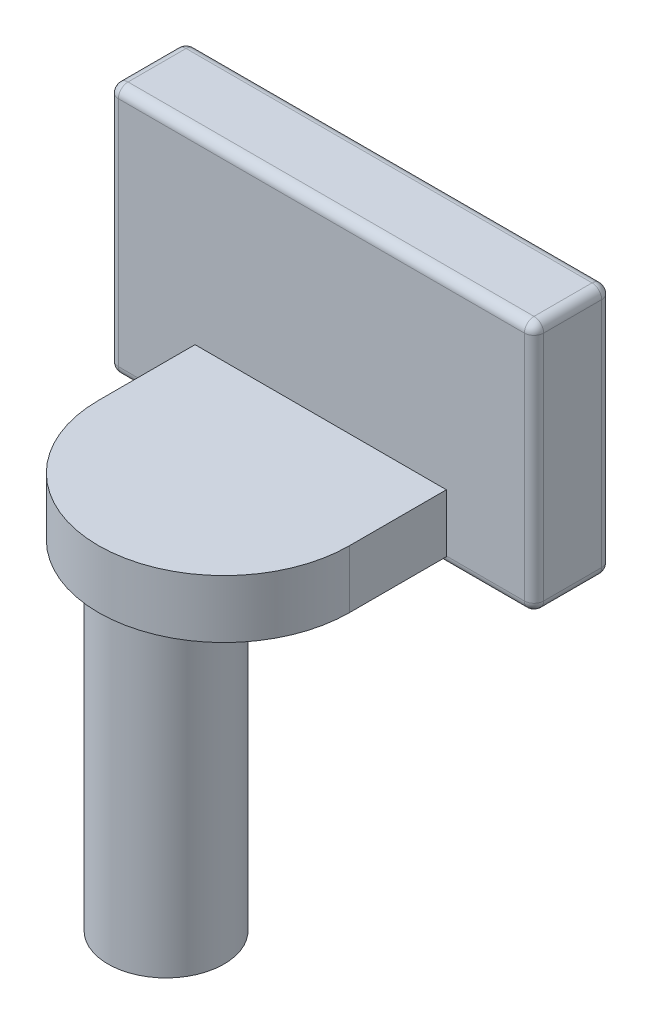
ISO-10303-21;
HEADER;
FILE_DESCRIPTION(('STEP AP214'),'2;1');
FILE_NAME('part.step','',(''),(''),'','','');
FILE_SCHEMA(('AUTOMOTIVE_DESIGN { 1 0 10303 214 1 1 1 1 }'));
ENDSEC;
DATA;
#1=APPLICATION_CONTEXT('core data for automotive mechanical design processes');
#2=APPLICATION_PROTOCOL_DEFINITION('international standard','automotive_design',2000,#1);
#3=PRODUCT_CONTEXT('',#1,'mechanical');
#4=PRODUCT('Part','Part','',(#3));
#5=PRODUCT_RELATED_PRODUCT_CATEGORY('part','',(#4));
#6=PRODUCT_DEFINITION_FORMATION('','',#4);
#7=PRODUCT_DEFINITION_CONTEXT('part definition',#1,'design');
#8=PRODUCT_DEFINITION('design','',#6,#7);
#9=PRODUCT_DEFINITION_SHAPE('','',#8);
#10=(LENGTH_UNIT() NAMED_UNIT(*) SI_UNIT(.MILLI.,.METRE.));
#11=(NAMED_UNIT(*) PLANE_ANGLE_UNIT() SI_UNIT($,.RADIAN.));
#12=(NAMED_UNIT(*) SI_UNIT($,.STERADIAN.) SOLID_ANGLE_UNIT());
#13=UNCERTAINTY_MEASURE_WITH_UNIT(LENGTH_MEASURE(1.E-05),#10,'distance_accuracy_value','');
#14=(GEOMETRIC_REPRESENTATION_CONTEXT(3) GLOBAL_UNCERTAINTY_ASSIGNED_CONTEXT((#13)) GLOBAL_UNIT_ASSIGNED_CONTEXT((#10,
#11,#12)) REPRESENTATION_CONTEXT('',''));
#15=CARTESIAN_POINT('',(0.,0.,0.));
#16=DIRECTION('',(0.,0.,1.));
#17=DIRECTION('',(1.,0.,0.));
#18=AXIS2_PLACEMENT_3D('',#15,#16,#17);
#19=CARTESIAN_POINT('',(0.,-30.,90.3432418316288));
#20=DIRECTION('',(0.,-1.,0.));
#21=DIRECTION('',(0.,0.,-1.));
#22=AXIS2_PLACEMENT_3D('',#19,#20,#21);
#23=CYLINDRICAL_SURFACE('',#22,65.);
#24=CARTESIAN_POINT('',(0.,-60.,90.3432418316288));
#25=DIRECTION('',(0.,1.,0.));
#26=DIRECTION('',(0.,0.,1.));
#27=AXIS2_PLACEMENT_3D('',#24,#25,#26);
#28=CIRCLE('',#27,65.);
#29=CARTESIAN_POINT('',(-65.,-60.,90.3432418316288));
#30=VERTEX_POINT('',#29);
#31=CARTESIAN_POINT('',(65.,-60.,90.3432418316288));
#32=VERTEX_POINT('',#31);
#33=EDGE_CURVE('E120',#30,#32,#28,.T.);
#34=ORIENTED_EDGE('',*,*,#33,.T.);
#35=DIRECTION('',(0.,-1.,0.));
#36=VECTOR('',#35,1.);
#37=CARTESIAN_POINT('',(65.,-30.,90.3432418316288));
#38=LINE('',#37,#36);
#39=CARTESIAN_POINT('',(65.,-30.,90.3432418316288));
#40=VERTEX_POINT('',#39);
#41=EDGE_CURVE('E52',#40,#32,#38,.T.);
#42=ORIENTED_EDGE('',*,*,#41,.F.);
#43=CARTESIAN_POINT('',(0.,-30.,90.3432418316288));
#44=DIRECTION('',(0.,1.,0.));
#45=DIRECTION('',(0.,0.,1.));
#46=AXIS2_PLACEMENT_3D('',#43,#44,#45);
#47=CIRCLE('',#46,65.);
#48=CARTESIAN_POINT('',(-65.,-30.,90.3432418316288));
#49=VERTEX_POINT('',#48);
#50=EDGE_CURVE('E103',#49,#40,#47,.T.);
#51=ORIENTED_EDGE('',*,*,#50,.F.);
#52=DIRECTION('',(0.,-1.,0.));
#53=VECTOR('',#52,1.);
#54=CARTESIAN_POINT('',(-65.,-30.,90.3432418316288));
#55=LINE('',#54,#53);
#56=EDGE_CURVE('E116',#49,#30,#55,.T.);
#57=ORIENTED_EDGE('',*,*,#56,.T.);
#58=EDGE_LOOP('',(#34,#42,#51,#57));
#59=FACE_BOUND('',#58,.T.);
#60=ADVANCED_FACE('F49',(#59),#23,.T.);
#61=CARTESIAN_POINT('',(65.,-30.,40.3432418316288));
#62=DIRECTION('',(-1.,0.,0.));
#63=DIRECTION('',(0.,0.,1.));
#64=AXIS2_PLACEMENT_3D('',#61,#62,#63);
#65=PLANE('',#64);
#66=DIRECTION('',(0.,0.,-1.));
#67=VECTOR('',#66,1.);
#68=CARTESIAN_POINT('',(65.,-60.,40.3432418316288));
#69=LINE('',#68,#67);
#70=CARTESIAN_POINT('',(65.,-60.,40.3432418316288));
#71=VERTEX_POINT('',#70);
#72=EDGE_CURVE('E109',#32,#71,#69,.T.);
#73=ORIENTED_EDGE('',*,*,#72,.T.);
#74=DIRECTION('',(0.,-1.,0.));
#75=VECTOR('',#74,1.);
#76=CARTESIAN_POINT('',(65.,-30.,40.3432418316288));
#77=LINE('',#76,#75);
#78=CARTESIAN_POINT('',(65.,-30.,40.3432418316288));
#79=VERTEX_POINT('',#78);
#80=EDGE_CURVE('E107',#79,#71,#77,.T.);
#81=ORIENTED_EDGE('',*,*,#80,.F.);
#82=DIRECTION('',(0.,0.,-1.));
#83=VECTOR('',#82,1.);
#84=CARTESIAN_POINT('',(65.,-30.,40.3432418316288));
#85=LINE('',#84,#83);
#86=EDGE_CURVE('E98',#40,#79,#85,.T.);
#87=ORIENTED_EDGE('',*,*,#86,.F.);
#88=ORIENTED_EDGE('',*,*,#41,.T.);
#89=EDGE_LOOP('',(#73,#81,#87,#88));
#90=FACE_BOUND('',#89,.T.);
#91=ADVANCED_FACE('F108',(#90),#65,.F.);
#92=CARTESIAN_POINT('',(-65.,-30.,40.3432418316288));
#93=DIRECTION('',(0.,0.,1.));
#94=DIRECTION('',(1.,0.,0.));
#95=AXIS2_PLACEMENT_3D('',#92,#93,#94);
#96=PLANE('',#95);
#97=DIRECTION('',(-1.,0.,0.));
#98=VECTOR('',#97,1.);
#99=CARTESIAN_POINT('',(-65.,-60.,40.3432418316288));
#100=LINE('',#99,#98);
#101=CARTESIAN_POINT('',(-65.,-60.,40.3432418316288));
#102=VERTEX_POINT('',#101);
#103=EDGE_CURVE('E84',#71,#102,#100,.T.);
#104=ORIENTED_EDGE('',*,*,#103,.T.);
#105=DIRECTION('',(0.,-1.,0.));
#106=VECTOR('',#105,1.);
#107=CARTESIAN_POINT('',(-65.,-30.,40.3432418316288));
#108=LINE('',#107,#106);
#109=CARTESIAN_POINT('',(-65.,-30.,40.3432418316288));
#110=VERTEX_POINT('',#109);
#111=EDGE_CURVE('E111',#110,#102,#108,.T.);
#112=ORIENTED_EDGE('',*,*,#111,.F.);
#113=DIRECTION('',(-1.,0.,0.));
#114=VECTOR('',#113,1.);
#115=CARTESIAN_POINT('',(-65.,-30.,40.3432418316288));
#116=LINE('',#115,#114);
#117=EDGE_CURVE('E101',#79,#110,#116,.T.);
#118=ORIENTED_EDGE('',*,*,#117,.F.);
#119=ORIENTED_EDGE('',*,*,#80,.T.);
#120=EDGE_LOOP('',(#104,#112,#118,#119));
#121=FACE_BOUND('',#120,.T.);
#122=ADVANCED_FACE('F112',(#121),#96,.F.);
#123=CARTESIAN_POINT('',(-65.,-30.,40.3432418316288));
#124=DIRECTION('',(1.,0.,0.));
#125=DIRECTION('',(0.,0.,-1.));
#126=AXIS2_PLACEMENT_3D('',#123,#124,#125);
#127=PLANE('',#126);
#128=DIRECTION('',(0.,0.,1.));
#129=VECTOR('',#128,1.);
#130=CARTESIAN_POINT('',(-65.,-60.,40.3432418316288));
#131=LINE('',#130,#129);
#132=EDGE_CURVE('E90',#102,#30,#131,.T.);
#133=ORIENTED_EDGE('',*,*,#132,.T.);
#134=ORIENTED_EDGE('',*,*,#56,.F.);
#135=DIRECTION('',(0.,0.,1.));
#136=VECTOR('',#135,1.);
#137=CARTESIAN_POINT('',(-65.,-30.,40.3432418316288));
#138=LINE('',#137,#136);
#139=EDGE_CURVE('E67',#110,#49,#138,.T.);
#140=ORIENTED_EDGE('',*,*,#139,.F.);
#141=ORIENTED_EDGE('',*,*,#111,.T.);
#142=EDGE_LOOP('',(#133,#134,#140,#141));
#143=FACE_BOUND('',#142,.T.);
#144=ADVANCED_FACE('F134',(#143),#127,.F.);
#145=CARTESIAN_POINT('',(0.,-30.,90.3432418316288));
#146=DIRECTION('',(0.,1.,0.));
#147=DIRECTION('',(0.,0.,1.));
#148=AXIS2_PLACEMENT_3D('',#145,#146,#147);
#149=PLANE('',#148);
#150=ORIENTED_EDGE('',*,*,#50,.T.);
#151=ORIENTED_EDGE('',*,*,#86,.T.);
#152=ORIENTED_EDGE('',*,*,#117,.T.);
#153=ORIENTED_EDGE('',*,*,#139,.T.);
#154=EDGE_LOOP('',(#150,#151,#152,#153));
#155=FACE_BOUND('',#154,.T.);
#156=ADVANCED_FACE('F99',(#155),#149,.T.);
#157=CARTESIAN_POINT('',(0.,-60.,90.3432418316288));
#158=DIRECTION('',(0.,1.,0.));
#159=DIRECTION('',(0.,0.,1.));
#160=AXIS2_PLACEMENT_3D('',#157,#158,#159);
#161=PLANE('',#160);
#162=CARTESIAN_POINT('',(0.,-60.,120.343241831629));
#163=DIRECTION('',(0.,-1.,0.));
#164=DIRECTION('',(0.,0.,-1.));
#165=AXIS2_PLACEMENT_3D('',#162,#163,#164);
#166=CIRCLE('',#165,30.);
#167=CARTESIAN_POINT('',(0.,-60.,90.3432418316288));
#168=VERTEX_POINT('',#167);
#169=EDGE_CURVE('E12',#168,#168,#166,.T.);
#170=ORIENTED_EDGE('',*,*,#169,.F.);
#171=EDGE_LOOP('',(#170));
#172=FACE_BOUND('',#171,.T.);
#173=ORIENTED_EDGE('',*,*,#33,.F.);
#174=ORIENTED_EDGE('',*,*,#132,.F.);
#175=ORIENTED_EDGE('',*,*,#103,.F.);
#176=ORIENTED_EDGE('',*,*,#72,.F.);
#177=EDGE_LOOP('',(#173,#174,#175,#176));
#178=FACE_BOUND('',#177,.T.);
#179=ADVANCED_FACE('F137',(#172,#178),#161,.F.);
#180=CARTESIAN_POINT('',(0.,-220.,120.343241831629));
#181=DIRECTION('',(0.,1.,0.));
#182=DIRECTION('',(0.,0.,1.));
#183=AXIS2_PLACEMENT_3D('',#180,#181,#182);
#184=CYLINDRICAL_SURFACE('',#183,30.);
#185=CARTESIAN_POINT('',(0.,-220.,120.343241831629));
#186=DIRECTION('',(0.,-1.,0.));
#187=DIRECTION('',(0.,0.,-1.));
#188=AXIS2_PLACEMENT_3D('',#185,#186,#187);
#189=CIRCLE('',#188,30.);
#190=CARTESIAN_POINT('',(0.,-220.,90.3432418316288));
#191=VERTEX_POINT('',#190);
#192=EDGE_CURVE('E124',#191,#191,#189,.T.);
#193=ORIENTED_EDGE('',*,*,#192,.F.);
#194=EDGE_LOOP('',(#193));
#195=FACE_BOUND('',#194,.T.);
#196=ORIENTED_EDGE('',*,*,#169,.T.);
#197=EDGE_LOOP('',(#196));
#198=FACE_BOUND('',#197,.T.);
#199=ADVANCED_FACE('F147',(#195,#198),#184,.T.);
#200=CARTESIAN_POINT('',(0.,-220.,120.343241831629));
#201=DIRECTION('',(0.,-1.,0.));
#202=DIRECTION('',(0.,0.,-1.));
#203=AXIS2_PLACEMENT_3D('',#200,#201,#202);
#204=PLANE('',#203);
#205=ORIENTED_EDGE('',*,*,#192,.T.);
#206=EDGE_LOOP('',(#205));
#207=FACE_BOUND('',#206,.T.);
#208=ADVANCED_FACE('F145',(#207),#204,.T.);
#209=CLOSED_SHELL('',(#60,#91,#122,#144,#156,#179,#199,#208));
#210=MANIFOLD_SOLID_BREP('B2',#209);
#211=CARTESIAN_POINT('',(-110.,65.,40.));
#212=DIRECTION('',(1.,0.,0.));
#213=DIRECTION('',(0.,0.,-1.));
#214=AXIS2_PLACEMENT_3D('',#211,#212,#213);
#215=PLANE('',#214);
#216=DIRECTION('',(0.,-1.,0.));
#217=VECTOR('',#216,1.);
#218=CARTESIAN_POINT('',(-110.,65.,5.));
#219=LINE('',#218,#217);
#220=CARTESIAN_POINT('',(-110.,60.,5.));
#221=VERTEX_POINT('',#220);
#222=CARTESIAN_POINT('',(-110.,-60.,5.));
#223=VERTEX_POINT('',#222);
#224=EDGE_CURVE('E390',#221,#223,#219,.T.);
#225=ORIENTED_EDGE('',*,*,#224,.T.);
#226=DIRECTION('',(0.,0.,-1.));
#227=VECTOR('',#226,1.);
#228=CARTESIAN_POINT('',(-110.,-60.,40.));
#229=LINE('',#228,#227);
#230=CARTESIAN_POINT('',(-110.,-60.,35.));
#231=VERTEX_POINT('',#230);
#232=EDGE_CURVE('E392',#223,#231,#229,.F.);
#233=ORIENTED_EDGE('',*,*,#232,.T.);
#234=DIRECTION('',(0.,-1.,0.));
#235=VECTOR('',#234,1.);
#236=CARTESIAN_POINT('',(-110.,65.,35.));
#237=LINE('',#236,#235);
#238=CARTESIAN_POINT('',(-110.,60.,35.));
#239=VERTEX_POINT('',#238);
#240=EDGE_CURVE('E386',#231,#239,#237,.F.);
#241=ORIENTED_EDGE('',*,*,#240,.T.);
#242=DIRECTION('',(0.,0.,-1.));
#243=VECTOR('',#242,1.);
#244=CARTESIAN_POINT('',(-110.,60.,0.));
#245=LINE('',#244,#243);
#246=EDGE_CURVE('E388',#239,#221,#245,.T.);
#247=ORIENTED_EDGE('',*,*,#246,.T.);
#248=EDGE_LOOP('',(#225,#233,#241,#247));
#249=FACE_BOUND('',#248,.T.);
#250=ADVANCED_FACE('F217',(#249),#215,.F.);
#251=CARTESIAN_POINT('',(-110.,-65.,40.));
#252=DIRECTION('',(0.,1.,0.));
#253=DIRECTION('',(0.,0.,1.));
#254=AXIS2_PLACEMENT_3D('',#251,#252,#253);
#255=PLANE('',#254);
#256=DIRECTION('',(1.,0.,0.));
#257=VECTOR('',#256,1.);
#258=CARTESIAN_POINT('',(-110.,-65.,35.));
#259=LINE('',#258,#257);
#260=CARTESIAN_POINT('',(105.,-65.,35.));
#261=VERTEX_POINT('',#260);
#262=CARTESIAN_POINT('',(-105.,-65.,35.));
#263=VERTEX_POINT('',#262);
#264=EDGE_CURVE('E378',#261,#263,#259,.F.);
#265=ORIENTED_EDGE('',*,*,#264,.T.);
#266=DIRECTION('',(0.,0.,-1.));
#267=VECTOR('',#266,1.);
#268=CARTESIAN_POINT('',(-105.,-65.,40.));
#269=LINE('',#268,#267);
#270=CARTESIAN_POINT('',(-105.,-65.,5.));
#271=VERTEX_POINT('',#270);
#272=EDGE_CURVE('E383',#263,#271,#269,.T.);
#273=ORIENTED_EDGE('',*,*,#272,.T.);
#274=DIRECTION('',(1.,0.,0.));
#275=VECTOR('',#274,1.);
#276=CARTESIAN_POINT('',(-110.,-65.,5.));
#277=LINE('',#276,#275);
#278=CARTESIAN_POINT('',(105.,-65.,5.));
#279=VERTEX_POINT('',#278);
#280=EDGE_CURVE('E381',#271,#279,#277,.T.);
#281=ORIENTED_EDGE('',*,*,#280,.T.);
#282=DIRECTION('',(0.,0.,-1.));
#283=VECTOR('',#282,1.);
#284=CARTESIAN_POINT('',(105.,-65.,40.));
#285=LINE('',#284,#283);
#286=EDGE_CURVE('E376',#279,#261,#285,.F.);
#287=ORIENTED_EDGE('',*,*,#286,.T.);
#288=EDGE_LOOP('',(#265,#273,#281,#287));
#289=FACE_BOUND('',#288,.T.);
#290=ADVANCED_FACE('F538',(#289),#255,.F.);
#291=CARTESIAN_POINT('',(110.,65.,40.));
#292=DIRECTION('',(1.,0.,0.));
#293=DIRECTION('',(0.,0.,-1.));
#294=AXIS2_PLACEMENT_3D('',#291,#292,#293);
#295=PLANE('',#294);
#296=DIRECTION('',(0.,-1.,0.));
#297=VECTOR('',#296,1.);
#298=CARTESIAN_POINT('',(110.,65.,35.));
#299=LINE('',#298,#297);
#300=CARTESIAN_POINT('',(110.,60.,35.));
#301=VERTEX_POINT('',#300);
#302=CARTESIAN_POINT('',(110.,-60.,35.));
#303=VERTEX_POINT('',#302);
#304=EDGE_CURVE('E426',#301,#303,#299,.T.);
#305=ORIENTED_EDGE('',*,*,#304,.T.);
#306=DIRECTION('',(0.,0.,-1.));
#307=VECTOR('',#306,1.);
#308=CARTESIAN_POINT('',(110.,-60.,0.));
#309=LINE('',#308,#307);
#310=CARTESIAN_POINT('',(110.,-60.,5.));
#311=VERTEX_POINT('',#310);
#312=EDGE_CURVE('E428',#303,#311,#309,.T.);
#313=ORIENTED_EDGE('',*,*,#312,.T.);
#314=DIRECTION('',(0.,-1.,0.));
#315=VECTOR('',#314,1.);
#316=CARTESIAN_POINT('',(110.,65.,5.));
#317=LINE('',#316,#315);
#318=CARTESIAN_POINT('',(110.,60.,5.));
#319=VERTEX_POINT('',#318);
#320=EDGE_CURVE('E422',#311,#319,#317,.F.);
#321=ORIENTED_EDGE('',*,*,#320,.T.);
#322=DIRECTION('',(0.,0.,-1.));
#323=VECTOR('',#322,1.);
#324=CARTESIAN_POINT('',(110.,60.,40.));
#325=LINE('',#324,#323);
#326=EDGE_CURVE('E424',#319,#301,#325,.F.);
#327=ORIENTED_EDGE('',*,*,#326,.T.);
#328=EDGE_LOOP('',(#305,#313,#321,#327));
#329=FACE_BOUND('',#328,.T.);
#330=ADVANCED_FACE('F544',(#329),#295,.T.);
#331=CARTESIAN_POINT('',(-110.,65.,40.));
#332=DIRECTION('',(0.,1.,0.));
#333=DIRECTION('',(0.,0.,1.));
#334=AXIS2_PLACEMENT_3D('',#331,#332,#333);
#335=PLANE('',#334);
#336=DIRECTION('',(1.,0.,0.));
#337=VECTOR('',#336,1.);
#338=CARTESIAN_POINT('',(-110.,65.,5.));
#339=LINE('',#338,#337);
#340=CARTESIAN_POINT('',(105.,65.,5.));
#341=VERTEX_POINT('',#340);
#342=CARTESIAN_POINT('',(-105.,65.,5.));
#343=VERTEX_POINT('',#342);
#344=EDGE_CURVE('E408',#341,#343,#339,.F.);
#345=ORIENTED_EDGE('',*,*,#344,.T.);
#346=DIRECTION('',(0.,0.,-1.));
#347=VECTOR('',#346,1.);
#348=CARTESIAN_POINT('',(-105.,65.,40.));
#349=LINE('',#348,#347);
#350=CARTESIAN_POINT('',(-105.,65.,35.));
#351=VERTEX_POINT('',#350);
#352=EDGE_CURVE('E410',#343,#351,#349,.F.);
#353=ORIENTED_EDGE('',*,*,#352,.T.);
#354=DIRECTION('',(1.,0.,0.));
#355=VECTOR('',#354,1.);
#356=CARTESIAN_POINT('',(-110.,65.,35.));
#357=LINE('',#356,#355);
#358=CARTESIAN_POINT('',(105.,65.,35.));
#359=VERTEX_POINT('',#358);
#360=EDGE_CURVE('E406',#351,#359,#357,.T.);
#361=ORIENTED_EDGE('',*,*,#360,.T.);
#362=DIRECTION('',(0.,0.,-1.));
#363=VECTOR('',#362,1.);
#364=CARTESIAN_POINT('',(105.,65.,40.));
#365=LINE('',#364,#363);
#366=EDGE_CURVE('E404',#359,#341,#365,.T.);
#367=ORIENTED_EDGE('',*,*,#366,.T.);
#368=EDGE_LOOP('',(#345,#353,#361,#367));
#369=FACE_BOUND('',#368,.T.);
#370=ADVANCED_FACE('F830',(#369),#335,.T.);
#371=CARTESIAN_POINT('',(0.,0.,40.));
#372=DIRECTION('',(0.,0.,1.));
#373=DIRECTION('',(1.,0.,0.));
#374=AXIS2_PLACEMENT_3D('',#371,#372,#373);
#375=PLANE('',#374);
#376=DIRECTION('',(1.,0.,0.));
#377=VECTOR('',#376,1.);
#378=CARTESIAN_POINT('',(0.,60.,40.));
#379=LINE('',#378,#377);
#380=CARTESIAN_POINT('',(105.,60.,40.));
#381=VERTEX_POINT('',#380);
#382=CARTESIAN_POINT('',(-105.,60.,40.));
#383=VERTEX_POINT('',#382);
#384=EDGE_CURVE('E417',#381,#383,#379,.F.);
#385=ORIENTED_EDGE('',*,*,#384,.T.);
#386=DIRECTION('',(0.,-1.,0.));
#387=VECTOR('',#386,1.);
#388=CARTESIAN_POINT('',(-105.,-65.,40.));
#389=LINE('',#388,#387);
#390=CARTESIAN_POINT('',(-105.,-60.,40.));
#391=VERTEX_POINT('',#390);
#392=EDGE_CURVE('E420',#383,#391,#389,.T.);
#393=ORIENTED_EDGE('',*,*,#392,.T.);
#394=DIRECTION('',(1.,0.,0.));
#395=VECTOR('',#394,1.);
#396=CARTESIAN_POINT('',(110.,-60.,40.));
#397=LINE('',#396,#395);
#398=CARTESIAN_POINT('',(105.,-60.,40.));
#399=VERTEX_POINT('',#398);
#400=EDGE_CURVE('E415',#391,#399,#397,.T.);
#401=ORIENTED_EDGE('',*,*,#400,.T.);
#402=DIRECTION('',(0.,-1.,0.));
#403=VECTOR('',#402,1.);
#404=CARTESIAN_POINT('',(105.,0.,40.));
#405=LINE('',#404,#403);
#406=EDGE_CURVE('E413',#399,#381,#405,.F.);
#407=ORIENTED_EDGE('',*,*,#406,.T.);
#408=EDGE_LOOP('',(#385,#393,#401,#407));
#409=FACE_BOUND('',#408,.T.);
#410=ADVANCED_FACE('F699',(#409),#375,.T.);
#411=CARTESIAN_POINT('',(0.,0.,0.));
#412=DIRECTION('',(0.,0.,1.));
#413=DIRECTION('',(1.,0.,0.));
#414=AXIS2_PLACEMENT_3D('',#411,#412,#413);
#415=PLANE('',#414);
#416=DIRECTION('',(1.,0.,0.));
#417=VECTOR('',#416,1.);
#418=CARTESIAN_POINT('',(0.,55.5,0.));
#419=LINE('',#418,#417);
#420=CARTESIAN_POINT('',(100.5,55.5,0.));
#421=VERTEX_POINT('',#420);
#422=CARTESIAN_POINT('',(-100.5,55.5,0.));
#423=VERTEX_POINT('',#422);
#424=EDGE_CURVE('E497',#421,#423,#419,.F.);
#425=ORIENTED_EDGE('',*,*,#424,.T.);
#426=DIRECTION('',(0.,1.,0.));
#427=VECTOR('',#426,1.);
#428=CARTESIAN_POINT('',(-100.5,0.,0.));
#429=LINE('',#428,#427);
#430=CARTESIAN_POINT('',(-100.5,-55.5,0.));
#431=VERTEX_POINT('',#430);
#432=EDGE_CURVE('E503',#423,#431,#429,.F.);
#433=ORIENTED_EDGE('',*,*,#432,.T.);
#434=DIRECTION('',(-1.,0.,0.));
#435=VECTOR('',#434,1.);
#436=CARTESIAN_POINT('',(0.,-55.5,0.));
#437=LINE('',#436,#435);
#438=CARTESIAN_POINT('',(100.5,-55.5,0.));
#439=VERTEX_POINT('',#438);
#440=EDGE_CURVE('E501',#431,#439,#437,.F.);
#441=ORIENTED_EDGE('',*,*,#440,.T.);
#442=DIRECTION('',(0.,-1.,0.));
#443=VECTOR('',#442,1.);
#444=CARTESIAN_POINT('',(100.5,0.,0.));
#445=LINE('',#444,#443);
#446=EDGE_CURVE('E499',#439,#421,#445,.F.);
#447=ORIENTED_EDGE('',*,*,#446,.T.);
#448=EDGE_LOOP('',(#425,#433,#441,#447));
#449=FACE_BOUND('',#448,.T.);
#450=DIRECTION('',(0.,-1.,0.));
#451=VECTOR('',#450,1.);
#452=CARTESIAN_POINT('',(105.,-65.,0.));
#453=LINE('',#452,#451);
#454=CARTESIAN_POINT('',(105.,60.,0.));
#455=VERTEX_POINT('',#454);
#456=CARTESIAN_POINT('',(105.,-60.,0.));
#457=VERTEX_POINT('',#456);
#458=EDGE_CURVE('E395',#455,#457,#453,.T.);
#459=ORIENTED_EDGE('',*,*,#458,.T.);
#460=DIRECTION('',(1.,0.,0.));
#461=VECTOR('',#460,1.);
#462=CARTESIAN_POINT('',(0.,-60.,0.));
#463=LINE('',#462,#461);
#464=CARTESIAN_POINT('',(-105.,-60.,0.));
#465=VERTEX_POINT('',#464);
#466=EDGE_CURVE('E401',#457,#465,#463,.F.);
#467=ORIENTED_EDGE('',*,*,#466,.T.);
#468=DIRECTION('',(0.,-1.,0.));
#469=VECTOR('',#468,1.);
#470=CARTESIAN_POINT('',(-105.,0.,0.));
#471=LINE('',#470,#469);
#472=CARTESIAN_POINT('',(-105.,60.,0.));
#473=VERTEX_POINT('',#472);
#474=EDGE_CURVE('E399',#465,#473,#471,.F.);
#475=ORIENTED_EDGE('',*,*,#474,.T.);
#476=DIRECTION('',(1.,0.,0.));
#477=VECTOR('',#476,1.);
#478=CARTESIAN_POINT('',(110.,60.,0.));
#479=LINE('',#478,#477);
#480=EDGE_CURVE('E397',#473,#455,#479,.T.);
#481=ORIENTED_EDGE('',*,*,#480,.T.);
#482=EDGE_LOOP('',(#459,#467,#475,#481));
#483=FACE_BOUND('',#482,.T.);
#484=ADVANCED_FACE('F628',(#449,#483),#415,.F.);
#485=CARTESIAN_POINT('',(105.,60.,40.));
#486=DIRECTION('',(0.,0.,-1.));
#487=DIRECTION('',(-1.,0.,0.));
#488=AXIS2_PLACEMENT_3D('',#485,#486,#487);
#489=CYLINDRICAL_SURFACE('',#488,5.);
#490=CARTESIAN_POINT('',(105.,60.,35.));
#491=DIRECTION('',(0.,0.,1.));
#492=DIRECTION('',(1.,0.,0.));
#493=AXIS2_PLACEMENT_3D('',#490,#491,#492);
#494=CIRCLE('',#493,5.);
#495=EDGE_CURVE('E379',#301,#359,#494,.T.);
#496=ORIENTED_EDGE('',*,*,#495,.F.);
#497=ORIENTED_EDGE('',*,*,#326,.F.);
#498=CARTESIAN_POINT('',(105.,60.,5.));
#499=DIRECTION('',(0.,0.,-1.));
#500=DIRECTION('',(-1.,0.,0.));
#501=AXIS2_PLACEMENT_3D('',#498,#499,#500);
#502=CIRCLE('',#501,5.);
#503=EDGE_CURVE('E491',#341,#319,#502,.T.);
#504=ORIENTED_EDGE('',*,*,#503,.F.);
#505=ORIENTED_EDGE('',*,*,#366,.F.);
#506=EDGE_LOOP('',(#496,#497,#504,#505));
#507=FACE_BOUND('',#506,.T.);
#508=ADVANCED_FACE('F624',(#507),#489,.T.);
#509=CARTESIAN_POINT('',(105.,60.,35.));
#510=DIRECTION('',(0.,0.,1.));
#511=DIRECTION('',(1.,0.,0.));
#512=AXIS2_PLACEMENT_3D('',#509,#510,#511);
#513=SPHERICAL_SURFACE('',#512,5.);
#514=CARTESIAN_POINT('',(105.,60.,35.));
#515=DIRECTION('',(0.,1.,0.));
#516=DIRECTION('',(0.,0.,1.));
#517=AXIS2_PLACEMENT_3D('',#514,#515,#516);
#518=CIRCLE('',#517,5.);
#519=EDGE_CURVE('E485',#301,#381,#518,.F.);
#520=ORIENTED_EDGE('',*,*,#519,.F.);
#521=ORIENTED_EDGE('',*,*,#495,.T.);
#522=CARTESIAN_POINT('',(105.,60.,35.));
#523=DIRECTION('',(1.,0.,0.));
#524=DIRECTION('',(0.,0.,-1.));
#525=AXIS2_PLACEMENT_3D('',#522,#523,#524);
#526=CIRCLE('',#525,5.);
#527=EDGE_CURVE('E488',#381,#359,#526,.F.);
#528=ORIENTED_EDGE('',*,*,#527,.F.);
#529=EDGE_LOOP('',(#520,#521,#528));
#530=FACE_BOUND('',#529,.T.);
#531=ADVANCED_FACE('F620',(#530),#513,.T.);
#532=CARTESIAN_POINT('',(105.,60.,5.));
#533=DIRECTION('',(0.,0.,1.));
#534=DIRECTION('',(1.,0.,0.));
#535=AXIS2_PLACEMENT_3D('',#532,#533,#534);
#536=SPHERICAL_SURFACE('',#535,5.);
#537=CARTESIAN_POINT('',(105.,60.,5.));
#538=DIRECTION('',(1.,0.,0.));
#539=DIRECTION('',(0.,0.,-1.));
#540=AXIS2_PLACEMENT_3D('',#537,#538,#539);
#541=CIRCLE('',#540,5.);
#542=EDGE_CURVE('E479',#341,#455,#541,.F.);
#543=ORIENTED_EDGE('',*,*,#542,.F.);
#544=ORIENTED_EDGE('',*,*,#503,.T.);
#545=CARTESIAN_POINT('',(105.,60.,5.));
#546=DIRECTION('',(0.,1.,0.));
#547=DIRECTION('',(0.,0.,1.));
#548=AXIS2_PLACEMENT_3D('',#545,#546,#547);
#549=CIRCLE('',#548,5.);
#550=EDGE_CURVE('E482',#455,#319,#549,.F.);
#551=ORIENTED_EDGE('',*,*,#550,.F.);
#552=EDGE_LOOP('',(#543,#544,#551));
#553=FACE_BOUND('',#552,.T.);
#554=ADVANCED_FACE('F616',(#553),#536,.T.);
#555=CARTESIAN_POINT('',(-110.,60.,35.));
#556=DIRECTION('',(1.,0.,0.));
#557=DIRECTION('',(0.,0.,-1.));
#558=AXIS2_PLACEMENT_3D('',#555,#556,#557);
#559=CYLINDRICAL_SURFACE('',#558,5.);
#560=ORIENTED_EDGE('',*,*,#527,.T.);
#561=ORIENTED_EDGE('',*,*,#360,.F.);
#562=CARTESIAN_POINT('',(-105.,60.,35.));
#563=DIRECTION('',(-1.,0.,0.));
#564=DIRECTION('',(0.,0.,1.));
#565=AXIS2_PLACEMENT_3D('',#562,#563,#564);
#566=CIRCLE('',#565,5.);
#567=EDGE_CURVE('E474',#383,#351,#566,.T.);
#568=ORIENTED_EDGE('',*,*,#567,.F.);
#569=ORIENTED_EDGE('',*,*,#384,.F.);
#570=EDGE_LOOP('',(#560,#561,#568,#569));
#571=FACE_BOUND('',#570,.T.);
#572=ADVANCED_FACE('F612',(#571),#559,.T.);
#573=CARTESIAN_POINT('',(105.,65.,35.));
#574=DIRECTION('',(0.,-1.,0.));
#575=DIRECTION('',(0.,0.,-1.));
#576=AXIS2_PLACEMENT_3D('',#573,#574,#575);
#577=CYLINDRICAL_SURFACE('',#576,5.);
#578=ORIENTED_EDGE('',*,*,#519,.T.);
#579=ORIENTED_EDGE('',*,*,#406,.F.);
#580=CARTESIAN_POINT('',(105.,-60.,35.));
#581=DIRECTION('',(0.,-1.,0.));
#582=DIRECTION('',(0.,0.,-1.));
#583=AXIS2_PLACEMENT_3D('',#580,#581,#582);
#584=CIRCLE('',#583,5.);
#585=EDGE_CURVE('E471',#303,#399,#584,.T.);
#586=ORIENTED_EDGE('',*,*,#585,.F.);
#587=ORIENTED_EDGE('',*,*,#304,.F.);
#588=EDGE_LOOP('',(#578,#579,#586,#587));
#589=FACE_BOUND('',#588,.T.);
#590=ADVANCED_FACE('F608',(#589),#577,.T.);
#591=CARTESIAN_POINT('',(105.,-60.,40.));
#592=DIRECTION('',(0.,0.,1.));
#593=DIRECTION('',(1.,0.,0.));
#594=AXIS2_PLACEMENT_3D('',#591,#592,#593);
#595=CYLINDRICAL_SURFACE('',#594,5.);
#596=CARTESIAN_POINT('',(105.,-60.,5.));
#597=DIRECTION('',(0.,0.,-1.));
#598=DIRECTION('',(0.,1.,0.));
#599=AXIS2_PLACEMENT_3D('',#596,#597,#598);
#600=CIRCLE('',#599,5.);
#601=EDGE_CURVE('E465',#311,#279,#600,.T.);
#602=ORIENTED_EDGE('',*,*,#601,.F.);
#603=ORIENTED_EDGE('',*,*,#312,.F.);
#604=CARTESIAN_POINT('',(105.,-60.,35.));
#605=DIRECTION('',(0.,0.,1.));
#606=DIRECTION('',(1.,0.,0.));
#607=AXIS2_PLACEMENT_3D('',#604,#605,#606);
#608=CIRCLE('',#607,5.);
#609=EDGE_CURVE('E468',#261,#303,#608,.T.);
#610=ORIENTED_EDGE('',*,*,#609,.F.);
#611=ORIENTED_EDGE('',*,*,#286,.F.);
#612=EDGE_LOOP('',(#602,#603,#610,#611));
#613=FACE_BOUND('',#612,.T.);
#614=ADVANCED_FACE('F604',(#613),#595,.T.);
#615=CARTESIAN_POINT('',(105.,0.,5.));
#616=DIRECTION('',(0.,1.,0.));
#617=DIRECTION('',(0.,0.,1.));
#618=AXIS2_PLACEMENT_3D('',#615,#616,#617);
#619=CYLINDRICAL_SURFACE('',#618,5.);
#620=ORIENTED_EDGE('',*,*,#550,.T.);
#621=ORIENTED_EDGE('',*,*,#320,.F.);
#622=CARTESIAN_POINT('',(105.,-60.,5.));
#623=DIRECTION('',(0.,-1.,0.));
#624=DIRECTION('',(1.,0.,0.));
#625=AXIS2_PLACEMENT_3D('',#622,#623,#624);
#626=CIRCLE('',#625,5.);
#627=EDGE_CURVE('E463',#457,#311,#626,.T.);
#628=ORIENTED_EDGE('',*,*,#627,.F.);
#629=ORIENTED_EDGE('',*,*,#458,.F.);
#630=EDGE_LOOP('',(#620,#621,#628,#629));
#631=FACE_BOUND('',#630,.T.);
#632=ADVANCED_FACE('F600',(#631),#619,.T.);
#633=CARTESIAN_POINT('',(0.,60.,5.));
#634=DIRECTION('',(-1.,0.,0.));
#635=DIRECTION('',(0.,0.,1.));
#636=AXIS2_PLACEMENT_3D('',#633,#634,#635);
#637=CYLINDRICAL_SURFACE('',#636,5.);
#638=ORIENTED_EDGE('',*,*,#542,.T.);
#639=ORIENTED_EDGE('',*,*,#480,.F.);
#640=CARTESIAN_POINT('',(-105.,60.,5.));
#641=DIRECTION('',(-1.,0.,0.));
#642=DIRECTION('',(0.,0.,1.));
#643=AXIS2_PLACEMENT_3D('',#640,#641,#642);
#644=CIRCLE('',#643,5.);
#645=EDGE_CURVE('E460',#343,#473,#644,.T.);
#646=ORIENTED_EDGE('',*,*,#645,.F.);
#647=ORIENTED_EDGE('',*,*,#344,.F.);
#648=EDGE_LOOP('',(#638,#639,#646,#647));
#649=FACE_BOUND('',#648,.T.);
#650=ADVANCED_FACE('F596',(#649),#637,.T.);
#651=CARTESIAN_POINT('',(-105.,60.,40.));
#652=DIRECTION('',(0.,0.,1.));
#653=DIRECTION('',(1.,0.,0.));
#654=AXIS2_PLACEMENT_3D('',#651,#652,#653);
#655=CYLINDRICAL_SURFACE('',#654,5.);
#656=CARTESIAN_POINT('',(-105.,60.,35.));
#657=DIRECTION('',(0.,0.,1.));
#658=DIRECTION('',(1.,0.,0.));
#659=AXIS2_PLACEMENT_3D('',#656,#657,#658);
#660=CIRCLE('',#659,5.);
#661=EDGE_CURVE('E476',#351,#239,#660,.T.);
#662=ORIENTED_EDGE('',*,*,#661,.F.);
#663=ORIENTED_EDGE('',*,*,#352,.F.);
#664=CARTESIAN_POINT('',(-105.,60.,5.));
#665=DIRECTION('',(0.,0.,-1.));
#666=DIRECTION('',(0.,1.,0.));
#667=AXIS2_PLACEMENT_3D('',#664,#665,#666);
#668=CIRCLE('',#667,5.);
#669=EDGE_CURVE('E457',#221,#343,#668,.T.);
#670=ORIENTED_EDGE('',*,*,#669,.F.);
#671=ORIENTED_EDGE('',*,*,#246,.F.);
#672=EDGE_LOOP('',(#662,#663,#670,#671));
#673=FACE_BOUND('',#672,.T.);
#674=ADVANCED_FACE('F592',(#673),#655,.T.);
#675=CARTESIAN_POINT('',(-105.,60.,35.));
#676=DIRECTION('',(0.,0.,1.));
#677=DIRECTION('',(1.,0.,0.));
#678=AXIS2_PLACEMENT_3D('',#675,#676,#677);
#679=SPHERICAL_SURFACE('',#678,5.);
#680=ORIENTED_EDGE('',*,*,#567,.T.);
#681=ORIENTED_EDGE('',*,*,#661,.T.);
#682=CARTESIAN_POINT('',(-105.,60.,35.));
#683=DIRECTION('',(0.,1.,0.));
#684=DIRECTION('',(0.,0.,1.));
#685=AXIS2_PLACEMENT_3D('',#682,#683,#684);
#686=CIRCLE('',#685,5.);
#687=EDGE_CURVE('E454',#383,#239,#686,.F.);
#688=ORIENTED_EDGE('',*,*,#687,.F.);
#689=EDGE_LOOP('',(#680,#681,#688));
#690=FACE_BOUND('',#689,.T.);
#691=ADVANCED_FACE('F588',(#690),#679,.T.);
#692=CARTESIAN_POINT('',(105.,-60.,35.));
#693=DIRECTION('',(0.,0.,1.));
#694=DIRECTION('',(1.,0.,0.));
#695=AXIS2_PLACEMENT_3D('',#692,#693,#694);
#696=SPHERICAL_SURFACE('',#695,5.);
#697=ORIENTED_EDGE('',*,*,#609,.T.);
#698=ORIENTED_EDGE('',*,*,#585,.T.);
#699=CARTESIAN_POINT('',(105.,-60.,35.));
#700=DIRECTION('',(1.,0.,0.));
#701=DIRECTION('',(0.,0.,-1.));
#702=AXIS2_PLACEMENT_3D('',#699,#700,#701);
#703=CIRCLE('',#702,5.);
#704=EDGE_CURVE('E451',#261,#399,#703,.F.);
#705=ORIENTED_EDGE('',*,*,#704,.F.);
#706=EDGE_LOOP('',(#697,#698,#705));
#707=FACE_BOUND('',#706,.T.);
#708=ADVANCED_FACE('F584',(#707),#696,.T.);
#709=CARTESIAN_POINT('',(105.,-60.,5.));
#710=DIRECTION('',(0.,0.,1.));
#711=DIRECTION('',(1.,0.,0.));
#712=AXIS2_PLACEMENT_3D('',#709,#710,#711);
#713=SPHERICAL_SURFACE('',#712,5.);
#714=ORIENTED_EDGE('',*,*,#627,.T.);
#715=ORIENTED_EDGE('',*,*,#601,.T.);
#716=CARTESIAN_POINT('',(105.,-60.,5.));
#717=DIRECTION('',(1.,0.,0.));
#718=DIRECTION('',(0.,0.,-1.));
#719=AXIS2_PLACEMENT_3D('',#716,#717,#718);
#720=CIRCLE('',#719,5.);
#721=EDGE_CURVE('E448',#457,#279,#720,.F.);
#722=ORIENTED_EDGE('',*,*,#721,.F.);
#723=EDGE_LOOP('',(#714,#715,#722));
#724=FACE_BOUND('',#723,.T.);
#725=ADVANCED_FACE('F580',(#724),#713,.T.);
#726=CARTESIAN_POINT('',(-105.,60.,5.));
#727=DIRECTION('',(0.,0.,1.));
#728=DIRECTION('',(1.,0.,0.));
#729=AXIS2_PLACEMENT_3D('',#726,#727,#728);
#730=SPHERICAL_SURFACE('',#729,5.);
#731=ORIENTED_EDGE('',*,*,#669,.T.);
#732=ORIENTED_EDGE('',*,*,#645,.T.);
#733=CARTESIAN_POINT('',(-105.,60.,5.));
#734=DIRECTION('',(0.,1.,0.));
#735=DIRECTION('',(0.,0.,1.));
#736=AXIS2_PLACEMENT_3D('',#733,#734,#735);
#737=CIRCLE('',#736,5.);
#738=EDGE_CURVE('E445',#221,#473,#737,.F.);
#739=ORIENTED_EDGE('',*,*,#738,.F.);
#740=EDGE_LOOP('',(#731,#732,#739));
#741=FACE_BOUND('',#740,.T.);
#742=ADVANCED_FACE('F576',(#741),#730,.T.);
#743=CARTESIAN_POINT('',(-105.,0.,35.));
#744=DIRECTION('',(0.,1.,0.));
#745=DIRECTION('',(0.,0.,1.));
#746=AXIS2_PLACEMENT_3D('',#743,#744,#745);
#747=CYLINDRICAL_SURFACE('',#746,5.);
#748=ORIENTED_EDGE('',*,*,#687,.T.);
#749=ORIENTED_EDGE('',*,*,#240,.F.);
#750=CARTESIAN_POINT('',(-105.,-60.,35.));
#751=DIRECTION('',(0.,-1.,0.));
#752=DIRECTION('',(0.,0.,-1.));
#753=AXIS2_PLACEMENT_3D('',#750,#751,#752);
#754=CIRCLE('',#753,5.);
#755=EDGE_CURVE('E442',#391,#231,#754,.T.);
#756=ORIENTED_EDGE('',*,*,#755,.F.);
#757=ORIENTED_EDGE('',*,*,#392,.F.);
#758=EDGE_LOOP('',(#748,#749,#756,#757));
#759=FACE_BOUND('',#758,.T.);
#760=ADVANCED_FACE('F572',(#759),#747,.T.);
#761=CARTESIAN_POINT('',(0.,-60.,35.));
#762=DIRECTION('',(-1.,0.,0.));
#763=DIRECTION('',(0.,0.,1.));
#764=AXIS2_PLACEMENT_3D('',#761,#762,#763);
#765=CYLINDRICAL_SURFACE('',#764,5.);
#766=ORIENTED_EDGE('',*,*,#704,.T.);
#767=ORIENTED_EDGE('',*,*,#400,.F.);
#768=CARTESIAN_POINT('',(-105.,-60.,35.));
#769=DIRECTION('',(-1.,0.,0.));
#770=DIRECTION('',(0.,0.,1.));
#771=AXIS2_PLACEMENT_3D('',#768,#769,#770);
#772=CIRCLE('',#771,5.);
#773=EDGE_CURVE('E439',#263,#391,#772,.T.);
#774=ORIENTED_EDGE('',*,*,#773,.F.);
#775=ORIENTED_EDGE('',*,*,#264,.F.);
#776=EDGE_LOOP('',(#766,#767,#774,#775));
#777=FACE_BOUND('',#776,.T.);
#778=ADVANCED_FACE('F568',(#777),#765,.T.);
#779=CARTESIAN_POINT('',(-110.,-60.,5.));
#780=DIRECTION('',(1.,0.,0.));
#781=DIRECTION('',(0.,0.,-1.));
#782=AXIS2_PLACEMENT_3D('',#779,#780,#781);
#783=CYLINDRICAL_SURFACE('',#782,5.);
#784=ORIENTED_EDGE('',*,*,#721,.T.);
#785=ORIENTED_EDGE('',*,*,#280,.F.);
#786=CARTESIAN_POINT('',(-105.,-60.,5.));
#787=DIRECTION('',(-1.,0.,0.));
#788=DIRECTION('',(0.,0.,1.));
#789=AXIS2_PLACEMENT_3D('',#786,#787,#788);
#790=CIRCLE('',#789,5.);
#791=EDGE_CURVE('E436',#465,#271,#790,.T.);
#792=ORIENTED_EDGE('',*,*,#791,.F.);
#793=ORIENTED_EDGE('',*,*,#466,.F.);
#794=EDGE_LOOP('',(#784,#785,#792,#793));
#795=FACE_BOUND('',#794,.T.);
#796=ADVANCED_FACE('F564',(#795),#783,.T.);
#797=CARTESIAN_POINT('',(-105.,65.,5.));
#798=DIRECTION('',(0.,-1.,0.));
#799=DIRECTION('',(0.,0.,-1.));
#800=AXIS2_PLACEMENT_3D('',#797,#798,#799);
#801=CYLINDRICAL_SURFACE('',#800,5.);
#802=ORIENTED_EDGE('',*,*,#738,.T.);
#803=ORIENTED_EDGE('',*,*,#474,.F.);
#804=CARTESIAN_POINT('',(-105.,-60.,5.));
#805=DIRECTION('',(0.,-1.,0.));
#806=DIRECTION('',(0.,0.,-1.));
#807=AXIS2_PLACEMENT_3D('',#804,#805,#806);
#808=CIRCLE('',#807,5.);
#809=EDGE_CURVE('E434',#223,#465,#808,.T.);
#810=ORIENTED_EDGE('',*,*,#809,.F.);
#811=ORIENTED_EDGE('',*,*,#224,.F.);
#812=EDGE_LOOP('',(#802,#803,#810,#811));
#813=FACE_BOUND('',#812,.T.);
#814=ADVANCED_FACE('F560',(#813),#801,.T.);
#815=CARTESIAN_POINT('',(-105.,-60.,35.));
#816=DIRECTION('',(0.,0.,1.));
#817=DIRECTION('',(1.,0.,0.));
#818=AXIS2_PLACEMENT_3D('',#815,#816,#817);
#819=SPHERICAL_SURFACE('',#818,5.);
#820=ORIENTED_EDGE('',*,*,#773,.T.);
#821=ORIENTED_EDGE('',*,*,#755,.T.);
#822=CARTESIAN_POINT('',(-105.,-60.,35.));
#823=DIRECTION('',(0.,0.,1.));
#824=DIRECTION('',(1.,0.,0.));
#825=AXIS2_PLACEMENT_3D('',#822,#823,#824);
#826=CIRCLE('',#825,5.);
#827=EDGE_CURVE('E432',#263,#231,#826,.F.);
#828=ORIENTED_EDGE('',*,*,#827,.F.);
#829=EDGE_LOOP('',(#820,#821,#828));
#830=FACE_BOUND('',#829,.T.);
#831=ADVANCED_FACE('F556',(#830),#819,.T.);
#832=CARTESIAN_POINT('',(-105.,-60.,5.));
#833=DIRECTION('',(0.,0.,1.));
#834=DIRECTION('',(1.,0.,0.));
#835=AXIS2_PLACEMENT_3D('',#832,#833,#834);
#836=SPHERICAL_SURFACE('',#835,5.);
#837=ORIENTED_EDGE('',*,*,#809,.T.);
#838=ORIENTED_EDGE('',*,*,#791,.T.);
#839=CARTESIAN_POINT('',(-105.,-60.,5.));
#840=DIRECTION('',(0.,0.,-1.));
#841=DIRECTION('',(-1.,0.,0.));
#842=AXIS2_PLACEMENT_3D('',#839,#840,#841);
#843=CIRCLE('',#842,5.);
#844=EDGE_CURVE('E372',#223,#271,#843,.F.);
#845=ORIENTED_EDGE('',*,*,#844,.F.);
#846=EDGE_LOOP('',(#837,#838,#845));
#847=FACE_BOUND('',#846,.T.);
#848=ADVANCED_FACE('F552',(#847),#836,.T.);
#849=CARTESIAN_POINT('',(-105.,-60.,40.));
#850=DIRECTION('',(0.,0.,-1.));
#851=DIRECTION('',(-1.,0.,0.));
#852=AXIS2_PLACEMENT_3D('',#849,#850,#851);
#853=CYLINDRICAL_SURFACE('',#852,5.);
#854=ORIENTED_EDGE('',*,*,#827,.T.);
#855=ORIENTED_EDGE('',*,*,#232,.F.);
#856=ORIENTED_EDGE('',*,*,#844,.T.);
#857=ORIENTED_EDGE('',*,*,#272,.F.);
#858=EDGE_LOOP('',(#854,#855,#856,#857));
#859=FACE_BOUND('',#858,.T.);
#860=ADVANCED_FACE('F549',(#859),#853,.T.);
#861=CARTESIAN_POINT('',(-97.5,52.5,15.));
#862=DIRECTION('',(-1.,0.,0.));
#863=DIRECTION('',(0.,0.,1.));
#864=AXIS2_PLACEMENT_3D('',#861,#862,#863);
#865=PLANE('',#864);
#866=DIRECTION('',(0.,0.,-1.));
#867=VECTOR('',#866,1.);
#868=CARTESIAN_POINT('',(-97.5,-52.5,15.));
#869=LINE('',#868,#867);
#870=CARTESIAN_POINT('',(-97.5,-52.5,15.));
#871=VERTEX_POINT('',#870);
#872=CARTESIAN_POINT('',(-97.5,-52.5,3.));
#873=VERTEX_POINT('',#872);
#874=EDGE_CURVE('E370',#871,#873,#869,.T.);
#875=ORIENTED_EDGE('',*,*,#874,.T.);
#876=DIRECTION('',(0.,1.,0.));
#877=VECTOR('',#876,1.);
#878=CARTESIAN_POINT('',(-97.5,52.5,3.));
#879=LINE('',#878,#877);
#880=CARTESIAN_POINT('',(-97.5,52.5,3.));
#881=VERTEX_POINT('',#880);
#882=EDGE_CURVE('E350',#873,#881,#879,.T.);
#883=ORIENTED_EDGE('',*,*,#882,.T.);
#884=DIRECTION('',(0.,0.,-1.));
#885=VECTOR('',#884,1.);
#886=CARTESIAN_POINT('',(-97.5,52.5,15.));
#887=LINE('',#886,#885);
#888=CARTESIAN_POINT('',(-97.5,52.5,15.));
#889=VERTEX_POINT('',#888);
#890=EDGE_CURVE('E342',#889,#881,#887,.T.);
#891=ORIENTED_EDGE('',*,*,#890,.F.);
#892=DIRECTION('',(0.,1.,0.));
#893=VECTOR('',#892,1.);
#894=CARTESIAN_POINT('',(-97.5,52.5,15.));
#895=LINE('',#894,#893);
#896=EDGE_CURVE('E347',#871,#889,#895,.T.);
#897=ORIENTED_EDGE('',*,*,#896,.F.);
#898=EDGE_LOOP('',(#875,#883,#891,#897));
#899=FACE_BOUND('',#898,.T.);
#900=ADVANCED_FACE('F345',(#899),#865,.F.);
#901=CARTESIAN_POINT('',(97.5,-52.5,15.));
#902=DIRECTION('',(0.,-1.,0.));
#903=DIRECTION('',(0.,0.,-1.));
#904=AXIS2_PLACEMENT_3D('',#901,#902,#903);
#905=PLANE('',#904);
#906=DIRECTION('',(0.,0.,-1.));
#907=VECTOR('',#906,1.);
#908=CARTESIAN_POINT('',(97.5,-52.5,15.));
#909=LINE('',#908,#907);
#910=CARTESIAN_POINT('',(97.5,-52.5,15.));
#911=VERTEX_POINT('',#910);
#912=CARTESIAN_POINT('',(97.5,-52.5,3.));
#913=VERTEX_POINT('',#912);
#914=EDGE_CURVE('E373',#911,#913,#909,.T.);
#915=ORIENTED_EDGE('',*,*,#914,.T.);
#916=DIRECTION('',(-1.,0.,0.));
#917=VECTOR('',#916,1.);
#918=CARTESIAN_POINT('',(97.5,-52.5,3.));
#919=LINE('',#918,#917);
#920=EDGE_CURVE('E506',#913,#873,#919,.T.);
#921=ORIENTED_EDGE('',*,*,#920,.T.);
#922=ORIENTED_EDGE('',*,*,#874,.F.);
#923=DIRECTION('',(-1.,0.,0.));
#924=VECTOR('',#923,1.);
#925=CARTESIAN_POINT('',(97.5,-52.5,15.));
#926=LINE('',#925,#924);
#927=EDGE_CURVE('E352',#911,#871,#926,.T.);
#928=ORIENTED_EDGE('',*,*,#927,.F.);
#929=EDGE_LOOP('',(#915,#921,#922,#928));
#930=FACE_BOUND('',#929,.T.);
#931=ADVANCED_FACE('F527',(#930),#905,.F.);
#932=CARTESIAN_POINT('',(97.5,52.5,15.));
#933=DIRECTION('',(1.,0.,0.));
#934=DIRECTION('',(0.,0.,-1.));
#935=AXIS2_PLACEMENT_3D('',#932,#933,#934);
#936=PLANE('',#935);
#937=DIRECTION('',(0.,0.,-1.));
#938=VECTOR('',#937,1.);
#939=CARTESIAN_POINT('',(97.5,52.5,15.));
#940=LINE('',#939,#938);
#941=CARTESIAN_POINT('',(97.5,52.5,15.));
#942=VERTEX_POINT('',#941);
#943=CARTESIAN_POINT('',(97.5,52.5,3.));
#944=VERTEX_POINT('',#943);
#945=EDGE_CURVE('E351',#942,#944,#940,.T.);
#946=ORIENTED_EDGE('',*,*,#945,.T.);
#947=DIRECTION('',(0.,-1.,0.));
#948=VECTOR('',#947,1.);
#949=CARTESIAN_POINT('',(97.5,52.5,3.));
#950=LINE('',#949,#948);
#951=EDGE_CURVE('E226',#944,#913,#950,.T.);
#952=ORIENTED_EDGE('',*,*,#951,.T.);
#953=ORIENTED_EDGE('',*,*,#914,.F.);
#954=DIRECTION('',(0.,-1.,0.));
#955=VECTOR('',#954,1.);
#956=CARTESIAN_POINT('',(97.5,52.5,15.));
#957=LINE('',#956,#955);
#958=EDGE_CURVE('E360',#942,#911,#957,.T.);
#959=ORIENTED_EDGE('',*,*,#958,.F.);
#960=EDGE_LOOP('',(#946,#952,#953,#959));
#961=FACE_BOUND('',#960,.T.);
#962=ADVANCED_FACE('F528',(#961),#936,.F.);
#963=CARTESIAN_POINT('',(97.5,52.5,15.));
#964=DIRECTION('',(0.,1.,0.));
#965=DIRECTION('',(0.,0.,1.));
#966=AXIS2_PLACEMENT_3D('',#963,#964,#965);
#967=PLANE('',#966);
#968=ORIENTED_EDGE('',*,*,#890,.T.);
#969=DIRECTION('',(1.,0.,0.));
#970=VECTOR('',#969,1.);
#971=CARTESIAN_POINT('',(97.5,52.5,3.));
#972=LINE('',#971,#970);
#973=EDGE_CURVE('E47',#881,#944,#972,.T.);
#974=ORIENTED_EDGE('',*,*,#973,.T.);
#975=ORIENTED_EDGE('',*,*,#945,.F.);
#976=DIRECTION('',(1.,0.,0.));
#977=VECTOR('',#976,1.);
#978=CARTESIAN_POINT('',(97.5,52.5,15.));
#979=LINE('',#978,#977);
#980=EDGE_CURVE('E355',#889,#942,#979,.T.);
#981=ORIENTED_EDGE('',*,*,#980,.F.);
#982=EDGE_LOOP('',(#968,#974,#975,#981));
#983=FACE_BOUND('',#982,.T.);
#984=ADVANCED_FACE('F356',(#983),#967,.F.);
#985=CARTESIAN_POINT('',(0.,0.,15.));
#986=DIRECTION('',(0.,0.,-1.));
#987=DIRECTION('',(-1.,0.,0.));
#988=AXIS2_PLACEMENT_3D('',#985,#986,#987);
#989=PLANE('',#988);
#990=ORIENTED_EDGE('',*,*,#896,.T.);
#991=ORIENTED_EDGE('',*,*,#980,.T.);
#992=ORIENTED_EDGE('',*,*,#958,.T.);
#993=ORIENTED_EDGE('',*,*,#927,.T.);
#994=EDGE_LOOP('',(#990,#991,#992,#993));
#995=FACE_BOUND('',#994,.T.);
#996=ADVANCED_FACE('F362',(#995),#989,.T.);
#997=CARTESIAN_POINT('',(100.5,52.5,3.));
#998=DIRECTION('',(0.,-1.,0.));
#999=DIRECTION('',(0.,0.,-1.));
#1000=AXIS2_PLACEMENT_3D('',#997,#998,#999);
#1001=CYLINDRICAL_SURFACE('',#1000,3.);
#1002=CARTESIAN_POINT('',(100.5,55.5,3.));
#1003=DIRECTION('',(0.707106781186547,-0.707106781186547,0.));
#1004=DIRECTION('',(-0.707106781186547,-0.707106781186547,0.));
#1005=AXIS2_PLACEMENT_3D('',#1002,#1003,#1004);
#1006=ELLIPSE('',#1005,4.24264068711928,3.);
#1007=EDGE_CURVE('E366',#421,#944,#1006,.F.);
#1008=ORIENTED_EDGE('',*,*,#1007,.F.);
#1009=ORIENTED_EDGE('',*,*,#446,.F.);
#1010=CARTESIAN_POINT('',(100.5,-55.5,3.));
#1011=DIRECTION('',(-0.707106781186547,-0.707106781186547,0.));
#1012=DIRECTION('',(-0.707106781186547,0.707106781186547,0.));
#1013=AXIS2_PLACEMENT_3D('',#1010,#1011,#1012);
#1014=ELLIPSE('',#1013,4.24264068711928,3.);
#1015=EDGE_CURVE('E221',#913,#439,#1014,.T.);
#1016=ORIENTED_EDGE('',*,*,#1015,.F.);
#1017=ORIENTED_EDGE('',*,*,#951,.F.);
#1018=EDGE_LOOP('',(#1008,#1009,#1016,#1017));
#1019=FACE_BOUND('',#1018,.T.);
#1020=ADVANCED_FACE('F219',(#1019),#1001,.T.);
#1021=CARTESIAN_POINT('',(97.5,-55.5,3.));
#1022=DIRECTION('',(-1.,0.,0.));
#1023=DIRECTION('',(0.,0.,1.));
#1024=AXIS2_PLACEMENT_3D('',#1021,#1022,#1023);
#1025=CYLINDRICAL_SURFACE('',#1024,3.);
#1026=ORIENTED_EDGE('',*,*,#1015,.T.);
#1027=ORIENTED_EDGE('',*,*,#440,.F.);
#1028=CARTESIAN_POINT('',(-100.5,-55.5,3.));
#1029=DIRECTION('',(-0.707106781186547,0.707106781186547,0.));
#1030=DIRECTION('',(0.707106781186547,0.707106781186547,0.));
#1031=AXIS2_PLACEMENT_3D('',#1028,#1029,#1030);
#1032=ELLIPSE('',#1031,4.24264068711928,3.);
#1033=EDGE_CURVE('E511',#873,#431,#1032,.T.);
#1034=ORIENTED_EDGE('',*,*,#1033,.F.);
#1035=ORIENTED_EDGE('',*,*,#920,.F.);
#1036=EDGE_LOOP('',(#1026,#1027,#1034,#1035));
#1037=FACE_BOUND('',#1036,.T.);
#1038=ADVANCED_FACE('F525',(#1037),#1025,.T.);
#1039=CARTESIAN_POINT('',(97.5,55.5,3.));
#1040=DIRECTION('',(1.,0.,0.));
#1041=DIRECTION('',(0.,0.,-1.));
#1042=AXIS2_PLACEMENT_3D('',#1039,#1040,#1041);
#1043=CYLINDRICAL_SURFACE('',#1042,3.);
#1044=ORIENTED_EDGE('',*,*,#1007,.T.);
#1045=ORIENTED_EDGE('',*,*,#973,.F.);
#1046=CARTESIAN_POINT('',(-100.5,55.5,3.));
#1047=DIRECTION('',(0.707106781186547,0.707106781186547,0.));
#1048=DIRECTION('',(-0.707106781186547,0.707106781186547,0.));
#1049=AXIS2_PLACEMENT_3D('',#1046,#1047,#1048);
#1050=ELLIPSE('',#1049,4.24264068711928,3.);
#1051=EDGE_CURVE('E509',#423,#881,#1050,.F.);
#1052=ORIENTED_EDGE('',*,*,#1051,.F.);
#1053=ORIENTED_EDGE('',*,*,#424,.F.);
#1054=EDGE_LOOP('',(#1044,#1045,#1052,#1053));
#1055=FACE_BOUND('',#1054,.T.);
#1056=ADVANCED_FACE('F516',(#1055),#1043,.T.);
#1057=CARTESIAN_POINT('',(-100.5,52.5,3.));
#1058=DIRECTION('',(0.,1.,0.));
#1059=DIRECTION('',(0.,0.,1.));
#1060=AXIS2_PLACEMENT_3D('',#1057,#1058,#1059);
#1061=CYLINDRICAL_SURFACE('',#1060,3.);
#1062=ORIENTED_EDGE('',*,*,#1033,.T.);
#1063=ORIENTED_EDGE('',*,*,#432,.F.);
#1064=ORIENTED_EDGE('',*,*,#1051,.T.);
#1065=ORIENTED_EDGE('',*,*,#882,.F.);
#1066=EDGE_LOOP('',(#1062,#1063,#1064,#1065));
#1067=FACE_BOUND('',#1066,.T.);
#1068=ADVANCED_FACE('F630',(#1067),#1061,.T.);
#1069=CLOSED_SHELL('',(#250,#290,#330,#370,#410,#484,#508,#531,#554,#572,#590,#614,#632,#650,
#674,#691,#708,#725,#742,#760,#778,#796,#814,#831,#848,#860,#900,#931,#962,#984,#996,#1020,
#1038,#1056,#1068));
#1070=MANIFOLD_SOLID_BREP('B6',#1069);
#1071=ADVANCED_BREP_SHAPE_REPRESENTATION('',(#18,#210,#1070),#14);
#1072=SHAPE_DEFINITION_REPRESENTATION(#9,#1071);
ENDSEC;
END-ISO-10303-21;
